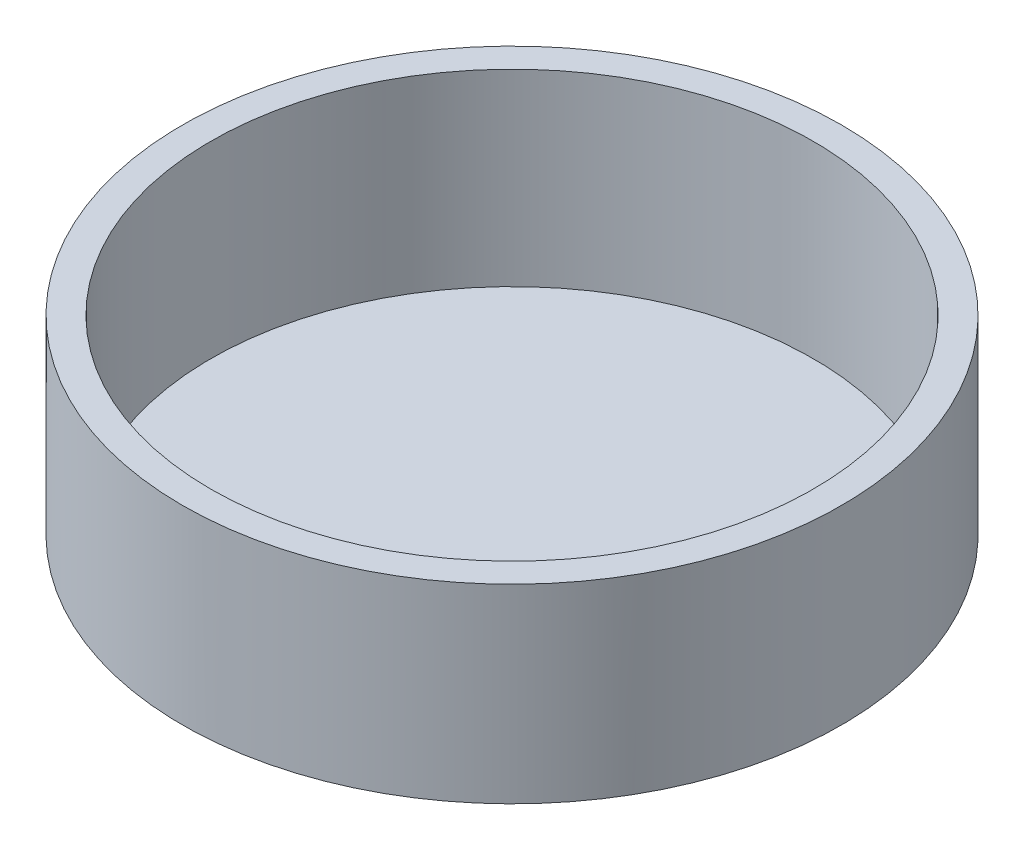
ISO-10303-21;
HEADER;
FILE_DESCRIPTION(('STEP AP214'),'2;1');
FILE_NAME('part.step','',(''),(''),'','','');
FILE_SCHEMA(('AUTOMOTIVE_DESIGN { 1 0 10303 214 1 1 1 1 }'));
ENDSEC;
DATA;
#1=APPLICATION_CONTEXT('core data for automotive mechanical design processes');
#2=APPLICATION_PROTOCOL_DEFINITION('international standard','automotive_design',2000,#1);
#3=PRODUCT_CONTEXT('',#1,'mechanical');
#4=PRODUCT('Part','Part','',(#3));
#5=PRODUCT_RELATED_PRODUCT_CATEGORY('part','',(#4));
#6=PRODUCT_DEFINITION_FORMATION('','',#4);
#7=PRODUCT_DEFINITION_CONTEXT('part definition',#1,'design');
#8=PRODUCT_DEFINITION('design','',#6,#7);
#9=PRODUCT_DEFINITION_SHAPE('','',#8);
#10=(LENGTH_UNIT() NAMED_UNIT(*) SI_UNIT(.MILLI.,.METRE.));
#11=(NAMED_UNIT(*) PLANE_ANGLE_UNIT() SI_UNIT($,.RADIAN.));
#12=(NAMED_UNIT(*) SI_UNIT($,.STERADIAN.) SOLID_ANGLE_UNIT());
#13=UNCERTAINTY_MEASURE_WITH_UNIT(LENGTH_MEASURE(1.E-05),#10,'distance_accuracy_value','');
#14=(GEOMETRIC_REPRESENTATION_CONTEXT(3) GLOBAL_UNCERTAINTY_ASSIGNED_CONTEXT((#13)) GLOBAL_UNIT_ASSIGNED_CONTEXT((#10,
#11,#12)) REPRESENTATION_CONTEXT('',''));
#15=CARTESIAN_POINT('',(0.,0.,0.));
#16=DIRECTION('',(0.,0.,1.));
#17=DIRECTION('',(1.,0.,0.));
#18=AXIS2_PLACEMENT_3D('',#15,#16,#17);
#19=CARTESIAN_POINT('',(0.,10.,0.));
#20=DIRECTION('',(0.,1.,0.));
#21=DIRECTION('',(0.,0.,1.));
#22=AXIS2_PLACEMENT_3D('',#19,#20,#21);
#23=PLANE('',#22);
#24=CARTESIAN_POINT('',(0.,10.,0.));
#25=DIRECTION('',(0.,1.,0.));
#26=DIRECTION('',(0.,0.,1.));
#27=AXIS2_PLACEMENT_3D('',#24,#25,#26);
#28=CIRCLE('',#27,17.5);
#29=CARTESIAN_POINT('',(0.,10.,17.5));
#30=VERTEX_POINT('',#29);
#31=EDGE_CURVE('E10',#30,#30,#28,.T.);
#32=ORIENTED_EDGE('',*,*,#31,.T.);
#33=EDGE_LOOP('',(#32));
#34=FACE_BOUND('',#33,.T.);
#35=CARTESIAN_POINT('',(0.,10.,0.));
#36=DIRECTION('',(0.,1.,0.));
#37=DIRECTION('',(0.,0.,1.));
#38=AXIS2_PLACEMENT_3D('',#35,#36,#37);
#39=CIRCLE('',#38,16.);
#40=CARTESIAN_POINT('',(0.,10.,16.));
#41=VERTEX_POINT('',#40);
#42=EDGE_CURVE('E40',#41,#41,#39,.T.);
#43=ORIENTED_EDGE('',*,*,#42,.F.);
#44=EDGE_LOOP('',(#43));
#45=FACE_BOUND('',#44,.T.);
#46=ADVANCED_FACE('F33',(#34,#45),#23,.T.);
#47=CARTESIAN_POINT('',(0.,10.,0.));
#48=DIRECTION('',(0.,-1.,0.));
#49=DIRECTION('',(0.,0.,-1.));
#50=AXIS2_PLACEMENT_3D('',#47,#48,#49);
#51=CYLINDRICAL_SURFACE('',#50,17.5);
#52=ORIENTED_EDGE('',*,*,#31,.F.);
#53=EDGE_LOOP('',(#52));
#54=FACE_BOUND('',#53,.T.);
#55=CARTESIAN_POINT('',(0.,-0.1,0.));
#56=DIRECTION('',(0.,-1.,0.));
#57=DIRECTION('',(0.,0.,-1.));
#58=AXIS2_PLACEMENT_3D('',#55,#56,#57);
#59=CIRCLE('',#58,17.5);
#60=CARTESIAN_POINT('',(0.,-0.1,-17.5));
#61=VERTEX_POINT('',#60);
#62=EDGE_CURVE('E49',#61,#61,#59,.T.);
#63=ORIENTED_EDGE('',*,*,#62,.F.);
#64=EDGE_LOOP('',(#63));
#65=FACE_BOUND('',#64,.T.);
#66=ADVANCED_FACE('F35',(#54,#65),#51,.T.);
#67=CARTESIAN_POINT('',(0.,10.,0.));
#68=DIRECTION('',(0.,-1.,0.));
#69=DIRECTION('',(0.,0.,-1.));
#70=AXIS2_PLACEMENT_3D('',#67,#68,#69);
#71=CYLINDRICAL_SURFACE('',#70,16.);
#72=ORIENTED_EDGE('',*,*,#42,.T.);
#73=EDGE_LOOP('',(#72));
#74=FACE_BOUND('',#73,.T.);
#75=CARTESIAN_POINT('',(0.,0.,0.));
#76=DIRECTION('',(0.,1.,0.));
#77=DIRECTION('',(0.,0.,1.));
#78=AXIS2_PLACEMENT_3D('',#75,#76,#77);
#79=CIRCLE('',#78,16.);
#80=CARTESIAN_POINT('',(0.,0.,16.));
#81=VERTEX_POINT('',#80);
#82=EDGE_CURVE('E44',#81,#81,#79,.T.);
#83=ORIENTED_EDGE('',*,*,#82,.F.);
#84=EDGE_LOOP('',(#83));
#85=FACE_BOUND('',#84,.T.);
#86=ADVANCED_FACE('F57',(#74,#85),#71,.F.);
#87=CARTESIAN_POINT('',(0.,0.,0.));
#88=DIRECTION('',(0.,-1.,0.));
#89=DIRECTION('',(0.,0.,-1.));
#90=AXIS2_PLACEMENT_3D('',#87,#88,#89);
#91=PLANE('',#90);
#92=ORIENTED_EDGE('',*,*,#82,.T.);
#93=EDGE_LOOP('',(#92));
#94=FACE_BOUND('',#93,.T.);
#95=ADVANCED_FACE('F63',(#94),#91,.F.);
#96=CARTESIAN_POINT('',(0.,-0.1,0.));
#97=DIRECTION('',(0.,-1.,0.));
#98=DIRECTION('',(0.,0.,-1.));
#99=AXIS2_PLACEMENT_3D('',#96,#97,#98);
#100=PLANE('',#99);
#101=ORIENTED_EDGE('',*,*,#62,.T.);
#102=EDGE_LOOP('',(#101));
#103=FACE_BOUND('',#102,.T.);
#104=ADVANCED_FACE('F54',(#103),#100,.T.);
#105=CLOSED_SHELL('',(#46,#66,#86,#95,#104));
#106=MANIFOLD_SOLID_BREP('B2',#105);
#107=ADVANCED_BREP_SHAPE_REPRESENTATION('',(#18,#106),#14);
#108=SHAPE_DEFINITION_REPRESENTATION(#9,#107);
ENDSEC;
END-ISO-10303-21;
